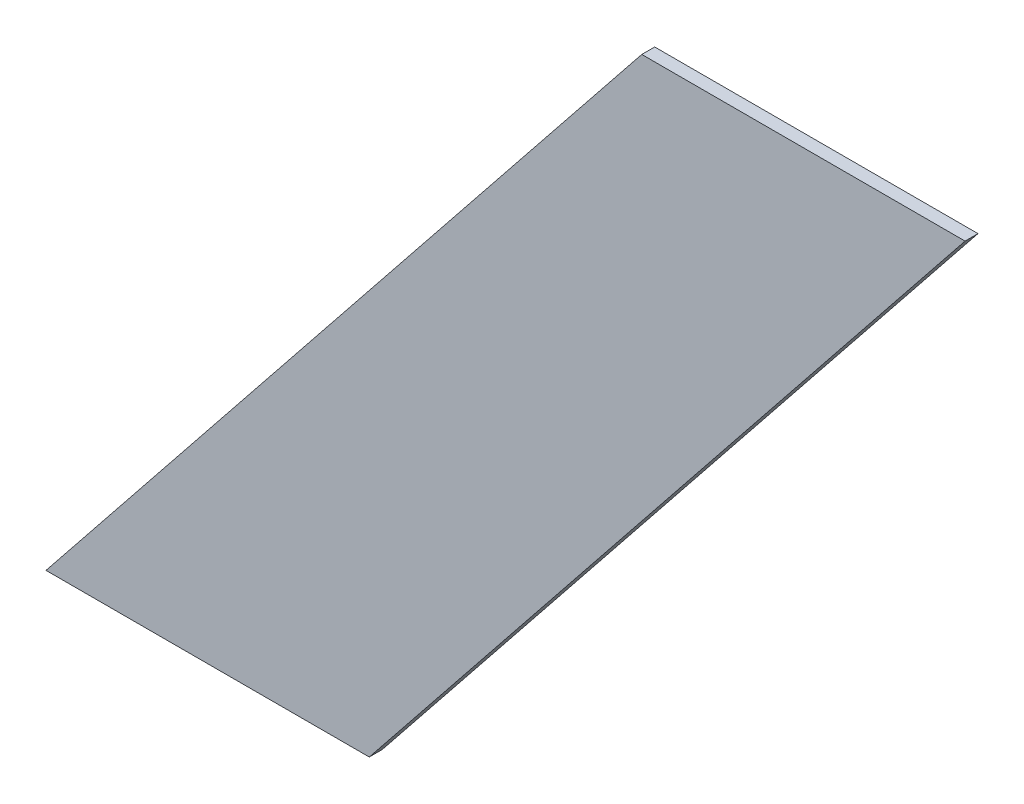
ISO-10303-21;
HEADER;
FILE_DESCRIPTION(('STEP AP214'),'2;1');
FILE_NAME('part.step','',(''),(''),'','','');
FILE_SCHEMA(('AUTOMOTIVE_DESIGN { 1 0 10303 214 1 1 1 1 }'));
ENDSEC;
DATA;
#1=APPLICATION_CONTEXT('core data for automotive mechanical design processes');
#2=APPLICATION_PROTOCOL_DEFINITION('international standard','automotive_design',2000,#1);
#3=PRODUCT_CONTEXT('',#1,'mechanical');
#4=PRODUCT('Part','Part','',(#3));
#5=PRODUCT_RELATED_PRODUCT_CATEGORY('part','',(#4));
#6=PRODUCT_DEFINITION_FORMATION('','',#4);
#7=PRODUCT_DEFINITION_CONTEXT('part definition',#1,'design');
#8=PRODUCT_DEFINITION('design','',#6,#7);
#9=PRODUCT_DEFINITION_SHAPE('','',#8);
#10=(LENGTH_UNIT() NAMED_UNIT(*) SI_UNIT(.MILLI.,.METRE.));
#11=(NAMED_UNIT(*) PLANE_ANGLE_UNIT() SI_UNIT($,.RADIAN.));
#12=(NAMED_UNIT(*) SI_UNIT($,.STERADIAN.) SOLID_ANGLE_UNIT());
#13=UNCERTAINTY_MEASURE_WITH_UNIT(LENGTH_MEASURE(1.E-05),#10,'distance_accuracy_value','');
#14=(GEOMETRIC_REPRESENTATION_CONTEXT(3) GLOBAL_UNCERTAINTY_ASSIGNED_CONTEXT((#13)) GLOBAL_UNIT_ASSIGNED_CONTEXT((#10,
#11,#12)) REPRESENTATION_CONTEXT('',''));
#15=CARTESIAN_POINT('',(0.,0.,0.));
#16=DIRECTION('',(0.,0.,1.));
#17=DIRECTION('',(1.,0.,0.));
#18=AXIS2_PLACEMENT_3D('',#15,#16,#17);
#19=CARTESIAN_POINT('',(50.8,0.,2.032));
#20=DIRECTION('',(0.,1.,0.));
#21=DIRECTION('',(-1.,0.,0.));
#22=AXIS2_PLACEMENT_3D('',#19,#20,#21);
#23=PLANE('',#22);
#24=DIRECTION('',(1.,0.,0.));
#25=VECTOR('',#24,1.);
#26=CARTESIAN_POINT('',(50.8,0.,0.));
#27=LINE('',#26,#25);
#28=CARTESIAN_POINT('',(0.,0.,0.));
#29=VERTEX_POINT('',#28);
#30=CARTESIAN_POINT('',(50.8,0.,0.));
#31=VERTEX_POINT('',#30);
#32=EDGE_CURVE('E96',#29,#31,#27,.T.);
#33=ORIENTED_EDGE('',*,*,#32,.T.);
#34=DIRECTION('',(0.,0.,-1.));
#35=VECTOR('',#34,1.);
#36=CARTESIAN_POINT('',(50.8,0.,2.032));
#37=LINE('',#36,#35);
#38=CARTESIAN_POINT('',(50.8,0.,2.032));
#39=VERTEX_POINT('',#38);
#40=EDGE_CURVE('E11',#39,#31,#37,.T.);
#41=ORIENTED_EDGE('',*,*,#40,.F.);
#42=DIRECTION('',(1.,0.,0.));
#43=VECTOR('',#42,1.);
#44=CARTESIAN_POINT('',(50.8,0.,2.032));
#45=LINE('',#44,#43);
#46=CARTESIAN_POINT('',(0.,0.,2.032));
#47=VERTEX_POINT('',#46);
#48=EDGE_CURVE('E84',#47,#39,#45,.T.);
#49=ORIENTED_EDGE('',*,*,#48,.F.);
#50=DIRECTION('',(0.,0.,-1.));
#51=VECTOR('',#50,1.);
#52=CARTESIAN_POINT('',(0.,0.,2.032));
#53=LINE('',#52,#51);
#54=EDGE_CURVE('E92',#47,#29,#53,.T.);
#55=ORIENTED_EDGE('',*,*,#54,.T.);
#56=EDGE_LOOP('',(#33,#41,#49,#55));
#57=FACE_BOUND('',#56,.T.);
#58=ADVANCED_FACE('F33',(#57),#23,.F.);
#59=CARTESIAN_POINT('',(144.417191448162,117.020686484733,2.032));
#60=DIRECTION('',(-0.780866718835798,0.624697660804501,0.));
#61=DIRECTION('',(-0.6246976608045,-0.780866718835798,0.));
#62=AXIS2_PLACEMENT_3D('',#59,#60,#61);
#63=PLANE('',#62);
#64=DIRECTION('',(0.6246976608045,0.780866718835798,0.));
#65=VECTOR('',#64,1.);
#66=CARTESIAN_POINT('',(144.417191448162,117.020686484733,0.));
#67=LINE('',#66,#65);
#68=CARTESIAN_POINT('',(144.417191448162,117.020686484733,0.));
#69=VERTEX_POINT('',#68);
#70=EDGE_CURVE('E88',#31,#69,#67,.T.);
#71=ORIENTED_EDGE('',*,*,#70,.T.);
#72=DIRECTION('',(0.,0.,-1.));
#73=VECTOR('',#72,1.);
#74=CARTESIAN_POINT('',(144.417191448162,117.020686484733,2.032));
#75=LINE('',#74,#73);
#76=CARTESIAN_POINT('',(144.417191448162,117.020686484733,2.032));
#77=VERTEX_POINT('',#76);
#78=EDGE_CURVE('E41',#77,#69,#75,.T.);
#79=ORIENTED_EDGE('',*,*,#78,.F.);
#80=DIRECTION('',(0.6246976608045,0.780866718835798,0.));
#81=VECTOR('',#80,1.);
#82=CARTESIAN_POINT('',(144.417191448162,117.020686484733,2.032));
#83=LINE('',#82,#81);
#84=EDGE_CURVE('E79',#39,#77,#83,.T.);
#85=ORIENTED_EDGE('',*,*,#84,.F.);
#86=ORIENTED_EDGE('',*,*,#40,.T.);
#87=EDGE_LOOP('',(#71,#79,#85,#86));
#88=FACE_BOUND('',#87,.T.);
#89=ADVANCED_FACE('F87',(#88),#63,.F.);
#90=CARTESIAN_POINT('',(93.6171914481624,117.020686484733,2.032));
#91=DIRECTION('',(0.,-1.,0.));
#92=DIRECTION('',(0.,0.,-1.));
#93=AXIS2_PLACEMENT_3D('',#90,#91,#92);
#94=PLANE('',#93);
#95=DIRECTION('',(-1.,0.,0.));
#96=VECTOR('',#95,1.);
#97=CARTESIAN_POINT('',(93.6171914481624,117.020686484733,0.));
#98=LINE('',#97,#96);
#99=CARTESIAN_POINT('',(93.6171914481624,117.020686484733,0.));
#100=VERTEX_POINT('',#99);
#101=EDGE_CURVE('E66',#69,#100,#98,.T.);
#102=ORIENTED_EDGE('',*,*,#101,.T.);
#103=DIRECTION('',(0.,0.,-1.));
#104=VECTOR('',#103,1.);
#105=CARTESIAN_POINT('',(93.6171914481624,117.020686484733,2.032));
#106=LINE('',#105,#104);
#107=CARTESIAN_POINT('',(93.6171914481624,117.020686484733,2.032));
#108=VERTEX_POINT('',#107);
#109=EDGE_CURVE('E89',#108,#100,#106,.T.);
#110=ORIENTED_EDGE('',*,*,#109,.F.);
#111=DIRECTION('',(-1.,0.,0.));
#112=VECTOR('',#111,1.);
#113=CARTESIAN_POINT('',(93.6171914481624,117.020686484733,2.032));
#114=LINE('',#113,#112);
#115=EDGE_CURVE('E82',#77,#108,#114,.T.);
#116=ORIENTED_EDGE('',*,*,#115,.F.);
#117=ORIENTED_EDGE('',*,*,#78,.T.);
#118=EDGE_LOOP('',(#102,#110,#116,#117));
#119=FACE_BOUND('',#118,.T.);
#120=ADVANCED_FACE('F90',(#119),#94,.F.);
#121=CARTESIAN_POINT('',(0.,0.,2.032));
#122=DIRECTION('',(0.780866718835798,-0.624697660804501,0.));
#123=DIRECTION('',(0.624697660804501,0.780866718835798,0.));
#124=AXIS2_PLACEMENT_3D('',#121,#122,#123);
#125=PLANE('',#124);
#126=DIRECTION('',(-0.6246976608045,-0.780866718835798,0.));
#127=VECTOR('',#126,1.);
#128=CARTESIAN_POINT('',(0.,0.,0.));
#129=LINE('',#128,#127);
#130=EDGE_CURVE('E72',#100,#29,#129,.T.);
#131=ORIENTED_EDGE('',*,*,#130,.T.);
#132=ORIENTED_EDGE('',*,*,#54,.F.);
#133=DIRECTION('',(-0.6246976608045,-0.780866718835798,0.));
#134=VECTOR('',#133,1.);
#135=CARTESIAN_POINT('',(0.,0.,2.032));
#136=LINE('',#135,#134);
#137=EDGE_CURVE('E49',#108,#47,#136,.T.);
#138=ORIENTED_EDGE('',*,*,#137,.F.);
#139=ORIENTED_EDGE('',*,*,#109,.T.);
#140=EDGE_LOOP('',(#131,#132,#138,#139));
#141=FACE_BOUND('',#140,.T.);
#142=ADVANCED_FACE('F103',(#141),#125,.F.);
#143=CARTESIAN_POINT('',(0.,0.,2.032));
#144=DIRECTION('',(0.,0.,-1.));
#145=DIRECTION('',(-1.,0.,0.));
#146=AXIS2_PLACEMENT_3D('',#143,#144,#145);
#147=PLANE('',#146);
#148=ORIENTED_EDGE('',*,*,#48,.T.);
#149=ORIENTED_EDGE('',*,*,#84,.T.);
#150=ORIENTED_EDGE('',*,*,#115,.T.);
#151=ORIENTED_EDGE('',*,*,#137,.T.);
#152=EDGE_LOOP('',(#148,#149,#150,#151));
#153=FACE_BOUND('',#152,.T.);
#154=ADVANCED_FACE('F80',(#153),#147,.F.);
#155=CARTESIAN_POINT('',(0.,0.,0.));
#156=DIRECTION('',(0.,0.,-1.));
#157=DIRECTION('',(-1.,0.,0.));
#158=AXIS2_PLACEMENT_3D('',#155,#156,#157);
#159=PLANE('',#158);
#160=ORIENTED_EDGE('',*,*,#32,.F.);
#161=ORIENTED_EDGE('',*,*,#130,.F.);
#162=ORIENTED_EDGE('',*,*,#101,.F.);
#163=ORIENTED_EDGE('',*,*,#70,.F.);
#164=EDGE_LOOP('',(#160,#161,#162,#163));
#165=FACE_BOUND('',#164,.T.);
#166=ADVANCED_FACE('F106',(#165),#159,.T.);
#167=CLOSED_SHELL('',(#58,#89,#120,#142,#154,#166));
#168=MANIFOLD_SOLID_BREP('B2',#167);
#169=ADVANCED_BREP_SHAPE_REPRESENTATION('',(#18,#168),#14);
#170=SHAPE_DEFINITION_REPRESENTATION(#9,#169);
ENDSEC;
END-ISO-10303-21;
